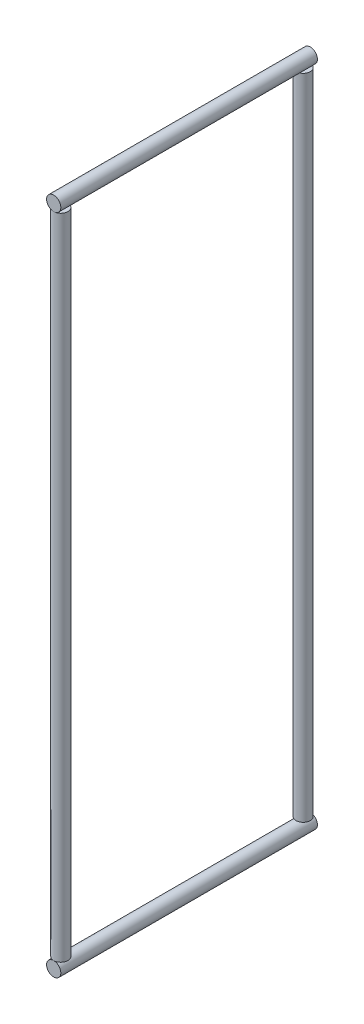
ISO-10303-21;
HEADER;
FILE_DESCRIPTION(('STEP AP214'),'2;1');
FILE_NAME('part.step','',(''),(''),'','','');
FILE_SCHEMA(('AUTOMOTIVE_DESIGN { 1 0 10303 214 1 1 1 1 }'));
ENDSEC;
DATA;
#1=APPLICATION_CONTEXT('core data for automotive mechanical design processes');
#2=APPLICATION_PROTOCOL_DEFINITION('international standard','automotive_design',2000,#1);
#3=PRODUCT_CONTEXT('',#1,'mechanical');
#4=PRODUCT('Part','Part','',(#3));
#5=PRODUCT_RELATED_PRODUCT_CATEGORY('part','',(#4));
#6=PRODUCT_DEFINITION_FORMATION('','',#4);
#7=PRODUCT_DEFINITION_CONTEXT('part definition',#1,'design');
#8=PRODUCT_DEFINITION('design','',#6,#7);
#9=PRODUCT_DEFINITION_SHAPE('','',#8);
#10=(LENGTH_UNIT() NAMED_UNIT(*) SI_UNIT(.MILLI.,.METRE.));
#11=(NAMED_UNIT(*) PLANE_ANGLE_UNIT() SI_UNIT($,.RADIAN.));
#12=(NAMED_UNIT(*) SI_UNIT($,.STERADIAN.) SOLID_ANGLE_UNIT());
#13=UNCERTAINTY_MEASURE_WITH_UNIT(LENGTH_MEASURE(1.E-05),#10,'distance_accuracy_value','');
#14=(GEOMETRIC_REPRESENTATION_CONTEXT(3) GLOBAL_UNCERTAINTY_ASSIGNED_CONTEXT((#13)) GLOBAL_UNIT_ASSIGNED_CONTEXT((#10,
#11,#12)) REPRESENTATION_CONTEXT('',''));
#15=CARTESIAN_POINT('',(0.,0.,0.));
#16=DIRECTION('',(0.,0.,1.));
#17=DIRECTION('',(1.,0.,0.));
#18=AXIS2_PLACEMENT_3D('',#15,#16,#17);
#19=CARTESIAN_POINT('',(0.,295.275,114.3));
#20=DIRECTION('',(0.,0.,-1.));
#21=DIRECTION('',(-1.,0.,0.));
#22=AXIS2_PLACEMENT_3D('',#19,#20,#21);
#23=CYLINDRICAL_SURFACE('',#22,3.175);
#24=CARTESIAN_POINT('',(0.,295.275,114.3));
#25=DIRECTION('',(0.,0.,1.));
#26=DIRECTION('',(1.,0.,0.));
#27=AXIS2_PLACEMENT_3D('',#24,#25,#26);
#28=CIRCLE('',#27,3.175);
#29=CARTESIAN_POINT('',(3.175,295.275,114.3));
#30=VERTEX_POINT('',#29);
#31=EDGE_CURVE('E11',#30,#30,#28,.T.);
#32=ORIENTED_EDGE('',*,*,#31,.F.);
#33=EDGE_LOOP('',(#32));
#34=FACE_BOUND('',#33,.T.);
#35=CARTESIAN_POINT('',(0.,295.275,0.));
#36=DIRECTION('',(0.,0.,1.));
#37=DIRECTION('',(1.,0.,0.));
#38=AXIS2_PLACEMENT_3D('',#35,#36,#37);
#39=CIRCLE('',#38,3.175);
#40=CARTESIAN_POINT('',(3.175,295.275,0.));
#41=VERTEX_POINT('',#40);
#42=EDGE_CURVE('E49',#41,#41,#39,.T.);
#43=ORIENTED_EDGE('',*,*,#42,.T.);
#44=EDGE_LOOP('',(#43));
#45=FACE_BOUND('',#44,.T.);
#46=ADVANCED_FACE('F46',(#34,#45),#23,.T.);
#47=CARTESIAN_POINT('',(0.,295.275,114.3));
#48=DIRECTION('',(0.,0.,1.));
#49=DIRECTION('',(1.,0.,0.));
#50=AXIS2_PLACEMENT_3D('',#47,#48,#49);
#51=PLANE('',#50);
#52=ORIENTED_EDGE('',*,*,#31,.T.);
#53=EDGE_LOOP('',(#52));
#54=FACE_BOUND('',#53,.T.);
#55=ADVANCED_FACE('F61',(#54),#51,.T.);
#56=CARTESIAN_POINT('',(0.,295.275,0.));
#57=DIRECTION('',(0.,0.,1.));
#58=DIRECTION('',(1.,0.,0.));
#59=AXIS2_PLACEMENT_3D('',#56,#57,#58);
#60=PLANE('',#59);
#61=ORIENTED_EDGE('',*,*,#42,.F.);
#62=EDGE_LOOP('',(#61));
#63=FACE_BOUND('',#62,.T.);
#64=ADVANCED_FACE('F59',(#63),#60,.F.);
#65=CLOSED_SHELL('',(#46,#55,#64));
#66=MANIFOLD_SOLID_BREP('B2',#65);
#67=CARTESIAN_POINT('',(0.,292.1,3.175));
#68=DIRECTION('',(0.,-1.,0.));
#69=DIRECTION('',(0.,0.,-1.));
#70=AXIS2_PLACEMENT_3D('',#67,#68,#69);
#71=CYLINDRICAL_SURFACE('',#70,3.175);
#72=CARTESIAN_POINT('',(0.,292.1,3.175));
#73=DIRECTION('',(0.,1.,0.));
#74=DIRECTION('',(0.,0.,1.));
#75=AXIS2_PLACEMENT_3D('',#72,#73,#74);
#76=CIRCLE('',#75,3.175);
#77=CARTESIAN_POINT('',(0.,292.1,6.35));
#78=VERTEX_POINT('',#77);
#79=EDGE_CURVE('E45',#78,#78,#76,.T.);
#80=ORIENTED_EDGE('',*,*,#79,.F.);
#81=EDGE_LOOP('',(#80));
#82=FACE_BOUND('',#81,.T.);
#83=CARTESIAN_POINT('',(0.,3.175,3.175));
#84=DIRECTION('',(0.,1.,0.));
#85=DIRECTION('',(0.,0.,1.));
#86=AXIS2_PLACEMENT_3D('',#83,#84,#85);
#87=CIRCLE('',#86,3.175);
#88=CARTESIAN_POINT('',(0.,3.175,6.35));
#89=VERTEX_POINT('',#88);
#90=EDGE_CURVE('E98',#89,#89,#87,.T.);
#91=ORIENTED_EDGE('',*,*,#90,.T.);
#92=EDGE_LOOP('',(#91));
#93=FACE_BOUND('',#92,.T.);
#94=ADVANCED_FACE('F95',(#82,#93),#71,.T.);
#95=CARTESIAN_POINT('',(0.,292.1,3.175));
#96=DIRECTION('',(0.,1.,0.));
#97=DIRECTION('',(0.,0.,1.));
#98=AXIS2_PLACEMENT_3D('',#95,#96,#97);
#99=PLANE('',#98);
#100=ORIENTED_EDGE('',*,*,#79,.T.);
#101=EDGE_LOOP('',(#100));
#102=FACE_BOUND('',#101,.T.);
#103=ADVANCED_FACE('F112',(#102),#99,.T.);
#104=CARTESIAN_POINT('',(0.,3.175,3.175));
#105=DIRECTION('',(0.,1.,0.));
#106=DIRECTION('',(0.,0.,1.));
#107=AXIS2_PLACEMENT_3D('',#104,#105,#106);
#108=PLANE('',#107);
#109=ORIENTED_EDGE('',*,*,#90,.F.);
#110=EDGE_LOOP('',(#109));
#111=FACE_BOUND('',#110,.T.);
#112=ADVANCED_FACE('F110',(#111),#108,.F.);
#113=CLOSED_SHELL('',(#94,#103,#112));
#114=MANIFOLD_SOLID_BREP('B6',#113);
#115=CARTESIAN_POINT('',(0.,292.1,111.125));
#116=DIRECTION('',(0.,-1.,0.));
#117=DIRECTION('',(0.,0.,-1.));
#118=AXIS2_PLACEMENT_3D('',#115,#116,#117);
#119=CYLINDRICAL_SURFACE('',#118,3.175);
#120=CARTESIAN_POINT('',(0.,292.1,111.125));
#121=DIRECTION('',(0.,1.,0.));
#122=DIRECTION('',(0.,0.,1.));
#123=AXIS2_PLACEMENT_3D('',#120,#121,#122);
#124=CIRCLE('',#123,3.175);
#125=CARTESIAN_POINT('',(0.,292.1,114.3));
#126=VERTEX_POINT('',#125);
#127=EDGE_CURVE('E94',#126,#126,#124,.T.);
#128=ORIENTED_EDGE('',*,*,#127,.F.);
#129=EDGE_LOOP('',(#128));
#130=FACE_BOUND('',#129,.T.);
#131=CARTESIAN_POINT('',(0.,3.175,111.125));
#132=DIRECTION('',(0.,1.,0.));
#133=DIRECTION('',(0.,0.,1.));
#134=AXIS2_PLACEMENT_3D('',#131,#132,#133);
#135=CIRCLE('',#134,3.175);
#136=CARTESIAN_POINT('',(0.,3.175,114.3));
#137=VERTEX_POINT('',#136);
#138=EDGE_CURVE('E148',#137,#137,#135,.T.);
#139=ORIENTED_EDGE('',*,*,#138,.T.);
#140=EDGE_LOOP('',(#139));
#141=FACE_BOUND('',#140,.T.);
#142=ADVANCED_FACE('F145',(#130,#141),#119,.T.);
#143=CARTESIAN_POINT('',(0.,292.1,111.125));
#144=DIRECTION('',(0.,1.,0.));
#145=DIRECTION('',(0.,0.,1.));
#146=AXIS2_PLACEMENT_3D('',#143,#144,#145);
#147=PLANE('',#146);
#148=ORIENTED_EDGE('',*,*,#127,.T.);
#149=EDGE_LOOP('',(#148));
#150=FACE_BOUND('',#149,.T.);
#151=ADVANCED_FACE('F160',(#150),#147,.T.);
#152=CARTESIAN_POINT('',(0.,3.175,111.125));
#153=DIRECTION('',(0.,1.,0.));
#154=DIRECTION('',(0.,0.,1.));
#155=AXIS2_PLACEMENT_3D('',#152,#153,#154);
#156=PLANE('',#155);
#157=ORIENTED_EDGE('',*,*,#138,.F.);
#158=EDGE_LOOP('',(#157));
#159=FACE_BOUND('',#158,.T.);
#160=ADVANCED_FACE('F158',(#159),#156,.F.);
#161=CLOSED_SHELL('',(#142,#151,#160));
#162=MANIFOLD_SOLID_BREP('B40',#161);
#163=CARTESIAN_POINT('',(0.,0.,114.3));
#164=DIRECTION('',(0.,0.,-1.));
#165=DIRECTION('',(-1.,0.,0.));
#166=AXIS2_PLACEMENT_3D('',#163,#164,#165);
#167=CYLINDRICAL_SURFACE('',#166,3.175);
#168=CARTESIAN_POINT('',(0.,0.,114.3));
#169=DIRECTION('',(0.,0.,1.));
#170=DIRECTION('',(1.,0.,0.));
#171=AXIS2_PLACEMENT_3D('',#168,#169,#170);
#172=CIRCLE('',#171,3.175);
#173=CARTESIAN_POINT('',(3.175,0.,114.3));
#174=VERTEX_POINT('',#173);
#175=EDGE_CURVE('E144',#174,#174,#172,.T.);
#176=ORIENTED_EDGE('',*,*,#175,.F.);
#177=EDGE_LOOP('',(#176));
#178=FACE_BOUND('',#177,.T.);
#179=CARTESIAN_POINT('',(0.,0.,0.));
#180=DIRECTION('',(0.,0.,1.));
#181=DIRECTION('',(1.,0.,0.));
#182=AXIS2_PLACEMENT_3D('',#179,#180,#181);
#183=CIRCLE('',#182,3.175);
#184=CARTESIAN_POINT('',(3.175,0.,0.));
#185=VERTEX_POINT('',#184);
#186=EDGE_CURVE('E189',#185,#185,#183,.T.);
#187=ORIENTED_EDGE('',*,*,#186,.T.);
#188=EDGE_LOOP('',(#187));
#189=FACE_BOUND('',#188,.T.);
#190=ADVANCED_FACE('F186',(#178,#189),#167,.T.);
#191=CARTESIAN_POINT('',(0.,0.,114.3));
#192=DIRECTION('',(0.,0.,1.));
#193=DIRECTION('',(1.,0.,0.));
#194=AXIS2_PLACEMENT_3D('',#191,#192,#193);
#195=PLANE('',#194);
#196=ORIENTED_EDGE('',*,*,#175,.T.);
#197=EDGE_LOOP('',(#196));
#198=FACE_BOUND('',#197,.T.);
#199=ADVANCED_FACE('F201',(#198),#195,.T.);
#200=CARTESIAN_POINT('',(0.,0.,0.));
#201=DIRECTION('',(0.,0.,1.));
#202=DIRECTION('',(1.,0.,0.));
#203=AXIS2_PLACEMENT_3D('',#200,#201,#202);
#204=PLANE('',#203);
#205=ORIENTED_EDGE('',*,*,#186,.F.);
#206=EDGE_LOOP('',(#205));
#207=FACE_BOUND('',#206,.T.);
#208=ADVANCED_FACE('F199',(#207),#204,.F.);
#209=CLOSED_SHELL('',(#190,#199,#208));
#210=MANIFOLD_SOLID_BREP('B89',#209);
#211=ADVANCED_BREP_SHAPE_REPRESENTATION('',(#18,#66,#114,#162,#210),#14);
#212=SHAPE_DEFINITION_REPRESENTATION(#9,#211);
ENDSEC;
END-ISO-10303-21;
